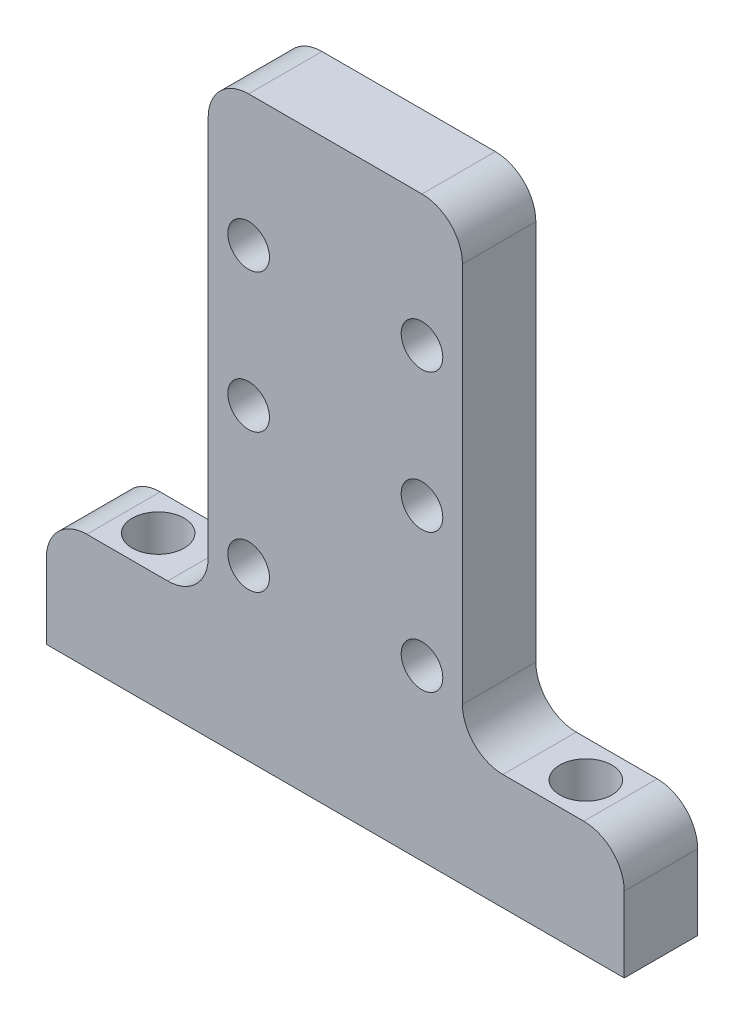
ISO-10303-21;
HEADER;
FILE_DESCRIPTION(('STEP AP214'),'2;1');
FILE_NAME('part.step','',(''),(''),'','','');
FILE_SCHEMA(('AUTOMOTIVE_DESIGN { 1 0 10303 214 1 1 1 1 }'));
ENDSEC;
DATA;
#1=APPLICATION_CONTEXT('core data for automotive mechanical design processes');
#2=APPLICATION_PROTOCOL_DEFINITION('international standard','automotive_design',2000,#1);
#3=PRODUCT_CONTEXT('',#1,'mechanical');
#4=PRODUCT('Part','Part','',(#3));
#5=PRODUCT_RELATED_PRODUCT_CATEGORY('part','',(#4));
#6=PRODUCT_DEFINITION_FORMATION('','',#4);
#7=PRODUCT_DEFINITION_CONTEXT('part definition',#1,'design');
#8=PRODUCT_DEFINITION('design','',#6,#7);
#9=PRODUCT_DEFINITION_SHAPE('','',#8);
#10=(LENGTH_UNIT() NAMED_UNIT(*) SI_UNIT(.MILLI.,.METRE.));
#11=(NAMED_UNIT(*) PLANE_ANGLE_UNIT() SI_UNIT($,.RADIAN.));
#12=(NAMED_UNIT(*) SI_UNIT($,.STERADIAN.) SOLID_ANGLE_UNIT());
#13=UNCERTAINTY_MEASURE_WITH_UNIT(LENGTH_MEASURE(1.E-05),#10,'distance_accuracy_value','');
#14=(GEOMETRIC_REPRESENTATION_CONTEXT(3) GLOBAL_UNCERTAINTY_ASSIGNED_CONTEXT((#13)) GLOBAL_UNIT_ASSIGNED_CONTEXT((#10,
#11,#12)) REPRESENTATION_CONTEXT('',''));
#15=CARTESIAN_POINT('',(0.,0.,0.));
#16=DIRECTION('',(0.,0.,1.));
#17=DIRECTION('',(1.,0.,0.));
#18=AXIS2_PLACEMENT_3D('',#15,#16,#17);
#19=CARTESIAN_POINT('',(25.,0.,6.35));
#20=DIRECTION('',(-1.,0.,0.));
#21=DIRECTION('',(0.,0.,1.));
#22=AXIS2_PLACEMENT_3D('',#19,#20,#21);
#23=PLANE('',#22);
#24=DIRECTION('',(0.,1.,0.));
#25=VECTOR('',#24,1.);
#26=CARTESIAN_POINT('',(25.,0.,0.));
#27=LINE('',#26,#25);
#28=CARTESIAN_POINT('',(25.,0.,0.));
#29=VERTEX_POINT('',#28);
#30=CARTESIAN_POINT('',(25.,6.5,0.));
#31=VERTEX_POINT('',#30);
#32=EDGE_CURVE('E168',#29,#31,#27,.T.);
#33=ORIENTED_EDGE('',*,*,#32,.T.);
#34=DIRECTION('',(0.,0.,-1.));
#35=VECTOR('',#34,1.);
#36=CARTESIAN_POINT('',(25.,6.5,6.35));
#37=LINE('',#36,#35);
#38=CARTESIAN_POINT('',(25.,6.5,6.35));
#39=VERTEX_POINT('',#38);
#40=EDGE_CURVE('E230',#31,#39,#37,.F.);
#41=ORIENTED_EDGE('',*,*,#40,.T.);
#42=DIRECTION('',(0.,1.,0.));
#43=VECTOR('',#42,1.);
#44=CARTESIAN_POINT('',(25.,0.,6.35));
#45=LINE('',#44,#43);
#46=CARTESIAN_POINT('',(25.,0.,6.35));
#47=VERTEX_POINT('',#46);
#48=EDGE_CURVE('E186',#47,#39,#45,.T.);
#49=ORIENTED_EDGE('',*,*,#48,.F.);
#50=DIRECTION('',(0.,0.,-1.));
#51=VECTOR('',#50,1.);
#52=CARTESIAN_POINT('',(25.,0.,6.35));
#53=LINE('',#52,#51);
#54=EDGE_CURVE('E159',#47,#29,#53,.T.);
#55=ORIENTED_EDGE('',*,*,#54,.T.);
#56=EDGE_LOOP('',(#33,#41,#49,#55));
#57=FACE_BOUND('',#56,.T.);
#58=ADVANCED_FACE('F35',(#57),#23,.F.);
#59=CARTESIAN_POINT('',(25.,10.,6.35));
#60=DIRECTION('',(0.,-1.,0.));
#61=DIRECTION('',(1.,0.,0.));
#62=AXIS2_PLACEMENT_3D('',#59,#60,#61);
#63=PLANE('',#62);
#64=CARTESIAN_POINT('',(18.5,10.,3.175));
#65=DIRECTION('',(0.,1.,0.));
#66=DIRECTION('',(0.,0.,1.));
#67=AXIS2_PLACEMENT_3D('',#64,#65,#66);
#68=CIRCLE('',#67,2.25);
#69=CARTESIAN_POINT('',(18.5,10.,5.42499999999999));
#70=VERTEX_POINT('',#69);
#71=EDGE_CURVE('E270',#70,#70,#68,.T.);
#72=ORIENTED_EDGE('',*,*,#71,.F.);
#73=EDGE_LOOP('',(#72));
#74=FACE_BOUND('',#73,.T.);
#75=DIRECTION('',(-1.,0.,0.));
#76=VECTOR('',#75,1.);
#77=CARTESIAN_POINT('',(25.,10.,6.35));
#78=LINE('',#77,#76);
#79=CARTESIAN_POINT('',(21.5,10.,6.35));
#80=VERTEX_POINT('',#79);
#81=CARTESIAN_POINT('',(14.5,10.,6.35));
#82=VERTEX_POINT('',#81);
#83=EDGE_CURVE('E247',#80,#82,#78,.T.);
#84=ORIENTED_EDGE('',*,*,#83,.F.);
#85=DIRECTION('',(0.,0.,-1.));
#86=VECTOR('',#85,1.);
#87=CARTESIAN_POINT('',(21.5,10.,6.35));
#88=LINE('',#87,#86);
#89=CARTESIAN_POINT('',(21.5,10.,0.));
#90=VERTEX_POINT('',#89);
#91=EDGE_CURVE('E227',#80,#90,#88,.T.);
#92=ORIENTED_EDGE('',*,*,#91,.T.);
#93=DIRECTION('',(-1.,0.,0.));
#94=VECTOR('',#93,1.);
#95=CARTESIAN_POINT('',(25.,10.,0.));
#96=LINE('',#95,#94);
#97=CARTESIAN_POINT('',(14.5,10.,0.));
#98=VERTEX_POINT('',#97);
#99=EDGE_CURVE('E171',#90,#98,#96,.T.);
#100=ORIENTED_EDGE('',*,*,#99,.T.);
#101=DIRECTION('',(0.,0.,-1.));
#102=VECTOR('',#101,1.);
#103=CARTESIAN_POINT('',(14.5,10.,6.35));
#104=LINE('',#103,#102);
#105=EDGE_CURVE('E190',#98,#82,#104,.F.);
#106=ORIENTED_EDGE('',*,*,#105,.T.);
#107=EDGE_LOOP('',(#84,#92,#100,#106));
#108=FACE_BOUND('',#107,.T.);
#109=ADVANCED_FACE('F349',(#74,#108),#63,.F.);
#110=CARTESIAN_POINT('',(11.,10.,6.35));
#111=DIRECTION('',(-1.,0.,0.));
#112=DIRECTION('',(0.,-1.,0.));
#113=AXIS2_PLACEMENT_3D('',#110,#111,#112);
#114=PLANE('',#113);
#115=DIRECTION('',(0.,1.,0.));
#116=VECTOR('',#115,1.);
#117=CARTESIAN_POINT('',(11.,10.,0.));
#118=LINE('',#117,#116);
#119=CARTESIAN_POINT('',(11.,13.5,0.));
#120=VERTEX_POINT('',#119);
#121=CARTESIAN_POINT('',(11.,46.5,0.));
#122=VERTEX_POINT('',#121);
#123=EDGE_CURVE('E174',#120,#122,#118,.T.);
#124=ORIENTED_EDGE('',*,*,#123,.T.);
#125=DIRECTION('',(0.,0.,-1.));
#126=VECTOR('',#125,1.);
#127=CARTESIAN_POINT('',(11.,46.5,6.35));
#128=LINE('',#127,#126);
#129=CARTESIAN_POINT('',(11.,46.5,6.35));
#130=VERTEX_POINT('',#129);
#131=EDGE_CURVE('E43',#122,#130,#128,.F.);
#132=ORIENTED_EDGE('',*,*,#131,.T.);
#133=DIRECTION('',(0.,1.,0.));
#134=VECTOR('',#133,1.);
#135=CARTESIAN_POINT('',(11.,10.,6.35));
#136=LINE('',#135,#134);
#137=CARTESIAN_POINT('',(11.,13.5,6.35));
#138=VERTEX_POINT('',#137);
#139=EDGE_CURVE('E240',#138,#130,#136,.T.);
#140=ORIENTED_EDGE('',*,*,#139,.F.);
#141=DIRECTION('',(0.,0.,-1.));
#142=VECTOR('',#141,1.);
#143=CARTESIAN_POINT('',(11.,13.5,0.));
#144=LINE('',#143,#142);
#145=EDGE_CURVE('E158',#138,#120,#144,.T.);
#146=ORIENTED_EDGE('',*,*,#145,.T.);
#147=EDGE_LOOP('',(#124,#132,#140,#146));
#148=FACE_BOUND('',#147,.T.);
#149=ADVANCED_FACE('F239',(#148),#114,.F.);
#150=CARTESIAN_POINT('',(11.,50.,6.35));
#151=DIRECTION('',(0.,-1.,0.));
#152=DIRECTION('',(0.,0.,-1.));
#153=AXIS2_PLACEMENT_3D('',#150,#151,#152);
#154=PLANE('',#153);
#155=DIRECTION('',(-1.,0.,0.));
#156=VECTOR('',#155,1.);
#157=CARTESIAN_POINT('',(11.,50.,6.35));
#158=LINE('',#157,#156);
#159=CARTESIAN_POINT('',(7.5,50.,6.35));
#160=VERTEX_POINT('',#159);
#161=CARTESIAN_POINT('',(-7.5,50.,6.35));
#162=VERTEX_POINT('',#161);
#163=EDGE_CURVE('E246',#160,#162,#158,.T.);
#164=ORIENTED_EDGE('',*,*,#163,.F.);
#165=DIRECTION('',(0.,0.,-1.));
#166=VECTOR('',#165,1.);
#167=CARTESIAN_POINT('',(7.5,50.,6.35));
#168=LINE('',#167,#166);
#169=CARTESIAN_POINT('',(7.5,50.,0.));
#170=VERTEX_POINT('',#169);
#171=EDGE_CURVE('E233',#160,#170,#168,.T.);
#172=ORIENTED_EDGE('',*,*,#171,.T.);
#173=DIRECTION('',(-1.,0.,0.));
#174=VECTOR('',#173,1.);
#175=CARTESIAN_POINT('',(11.,50.,0.));
#176=LINE('',#175,#174);
#177=CARTESIAN_POINT('',(-7.5,50.,0.));
#178=VERTEX_POINT('',#177);
#179=EDGE_CURVE('E177',#170,#178,#176,.T.);
#180=ORIENTED_EDGE('',*,*,#179,.T.);
#181=DIRECTION('',(0.,0.,-1.));
#182=VECTOR('',#181,1.);
#183=CARTESIAN_POINT('',(-7.5,50.,6.35));
#184=LINE('',#183,#182);
#185=EDGE_CURVE('E58',#178,#162,#184,.F.);
#186=ORIENTED_EDGE('',*,*,#185,.T.);
#187=EDGE_LOOP('',(#164,#172,#180,#186));
#188=FACE_BOUND('',#187,.T.);
#189=ADVANCED_FACE('F252',(#188),#154,.F.);
#190=CARTESIAN_POINT('',(-11.,9.99999999999999,6.35));
#191=DIRECTION('',(1.,0.,0.));
#192=DIRECTION('',(0.,1.,0.));
#193=AXIS2_PLACEMENT_3D('',#190,#191,#192);
#194=PLANE('',#193);
#195=DIRECTION('',(0.,-1.,0.));
#196=VECTOR('',#195,1.);
#197=CARTESIAN_POINT('',(-11.,9.99999999999999,6.35));
#198=LINE('',#197,#196);
#199=CARTESIAN_POINT('',(-11.,46.5,6.35));
#200=VERTEX_POINT('',#199);
#201=CARTESIAN_POINT('',(-11.,13.5,6.35));
#202=VERTEX_POINT('',#201);
#203=EDGE_CURVE('E260',#200,#202,#198,.T.);
#204=ORIENTED_EDGE('',*,*,#203,.F.);
#205=DIRECTION('',(0.,0.,-1.));
#206=VECTOR('',#205,1.);
#207=CARTESIAN_POINT('',(-11.,46.5,6.35));
#208=LINE('',#207,#206);
#209=CARTESIAN_POINT('',(-11.,46.5,0.));
#210=VERTEX_POINT('',#209);
#211=EDGE_CURVE('E11',#200,#210,#208,.T.);
#212=ORIENTED_EDGE('',*,*,#211,.T.);
#213=DIRECTION('',(0.,-1.,0.));
#214=VECTOR('',#213,1.);
#215=CARTESIAN_POINT('',(-11.,9.99999999999999,0.));
#216=LINE('',#215,#214);
#217=CARTESIAN_POINT('',(-11.,13.5,0.));
#218=VERTEX_POINT('',#217);
#219=EDGE_CURVE('E179',#210,#218,#216,.T.);
#220=ORIENTED_EDGE('',*,*,#219,.T.);
#221=DIRECTION('',(0.,0.,-1.));
#222=VECTOR('',#221,1.);
#223=CARTESIAN_POINT('',(-11.,13.5,6.35));
#224=LINE('',#223,#222);
#225=EDGE_CURVE('E196',#218,#202,#224,.F.);
#226=ORIENTED_EDGE('',*,*,#225,.T.);
#227=EDGE_LOOP('',(#204,#212,#220,#226));
#228=FACE_BOUND('',#227,.T.);
#229=ADVANCED_FACE('F259',(#228),#194,.F.);
#230=CARTESIAN_POINT('',(-25.,9.99999999999999,6.35));
#231=DIRECTION('',(0.,-1.,0.));
#232=DIRECTION('',(1.,0.,0.));
#233=AXIS2_PLACEMENT_3D('',#230,#231,#232);
#234=PLANE('',#233);
#235=CARTESIAN_POINT('',(-18.5,9.99999999999999,3.175));
#236=DIRECTION('',(0.,1.,0.));
#237=DIRECTION('',(0.,0.,1.));
#238=AXIS2_PLACEMENT_3D('',#235,#236,#237);
#239=CIRCLE('',#238,2.25);
#240=CARTESIAN_POINT('',(-18.5,9.99999999999999,5.425));
#241=VERTEX_POINT('',#240);
#242=EDGE_CURVE('E276',#241,#241,#239,.T.);
#243=ORIENTED_EDGE('',*,*,#242,.F.);
#244=EDGE_LOOP('',(#243));
#245=FACE_BOUND('',#244,.T.);
#246=DIRECTION('',(-1.,0.,0.));
#247=VECTOR('',#246,1.);
#248=CARTESIAN_POINT('',(-25.,9.99999999999999,0.));
#249=LINE('',#248,#247);
#250=CARTESIAN_POINT('',(-14.5,9.99999999999999,0.));
#251=VERTEX_POINT('',#250);
#252=CARTESIAN_POINT('',(-21.5,9.99999999999999,0.));
#253=VERTEX_POINT('',#252);
#254=EDGE_CURVE('E181',#251,#253,#249,.T.);
#255=ORIENTED_EDGE('',*,*,#254,.T.);
#256=DIRECTION('',(0.,0.,-1.));
#257=VECTOR('',#256,1.);
#258=CARTESIAN_POINT('',(-21.5,9.99999999999999,6.35));
#259=LINE('',#258,#257);
#260=CARTESIAN_POINT('',(-21.5,9.99999999999999,6.35));
#261=VERTEX_POINT('',#260);
#262=EDGE_CURVE('E219',#253,#261,#259,.F.);
#263=ORIENTED_EDGE('',*,*,#262,.T.);
#264=DIRECTION('',(-1.,0.,0.));
#265=VECTOR('',#264,1.);
#266=CARTESIAN_POINT('',(-25.,9.99999999999999,6.35));
#267=LINE('',#266,#265);
#268=CARTESIAN_POINT('',(-14.5,9.99999999999999,6.35));
#269=VERTEX_POINT('',#268);
#270=EDGE_CURVE('E149',#269,#261,#267,.T.);
#271=ORIENTED_EDGE('',*,*,#270,.F.);
#272=DIRECTION('',(0.,0.,-1.));
#273=VECTOR('',#272,1.);
#274=CARTESIAN_POINT('',(-14.5,9.99999999999999,0.));
#275=LINE('',#274,#273);
#276=EDGE_CURVE('E193',#269,#251,#275,.T.);
#277=ORIENTED_EDGE('',*,*,#276,.T.);
#278=EDGE_LOOP('',(#255,#263,#271,#277));
#279=FACE_BOUND('',#278,.T.);
#280=ADVANCED_FACE('F425',(#245,#279),#234,.F.);
#281=CARTESIAN_POINT('',(-25.,0.,6.35));
#282=DIRECTION('',(1.,0.,0.));
#283=DIRECTION('',(0.,1.,0.));
#284=AXIS2_PLACEMENT_3D('',#281,#282,#283);
#285=PLANE('',#284);
#286=DIRECTION('',(0.,-1.,0.));
#287=VECTOR('',#286,1.);
#288=CARTESIAN_POINT('',(-25.,0.,6.35));
#289=LINE('',#288,#287);
#290=CARTESIAN_POINT('',(-25.,6.49999999999999,6.35));
#291=VERTEX_POINT('',#290);
#292=CARTESIAN_POINT('',(-25.,0.,6.35));
#293=VERTEX_POINT('',#292);
#294=EDGE_CURVE('E136',#291,#293,#289,.T.);
#295=ORIENTED_EDGE('',*,*,#294,.F.);
#296=DIRECTION('',(0.,0.,-1.));
#297=VECTOR('',#296,1.);
#298=CARTESIAN_POINT('',(-25.,6.49999999999999,6.35));
#299=LINE('',#298,#297);
#300=CARTESIAN_POINT('',(-25.,6.49999999999999,0.));
#301=VERTEX_POINT('',#300);
#302=EDGE_CURVE('E209',#291,#301,#299,.T.);
#303=ORIENTED_EDGE('',*,*,#302,.T.);
#304=DIRECTION('',(0.,-1.,0.));
#305=VECTOR('',#304,1.);
#306=CARTESIAN_POINT('',(-25.,0.,0.));
#307=LINE('',#306,#305);
#308=CARTESIAN_POINT('',(-25.,0.,0.));
#309=VERTEX_POINT('',#308);
#310=EDGE_CURVE('E155',#301,#309,#307,.T.);
#311=ORIENTED_EDGE('',*,*,#310,.T.);
#312=DIRECTION('',(0.,0.,-1.));
#313=VECTOR('',#312,1.);
#314=CARTESIAN_POINT('',(-25.,0.,6.35));
#315=LINE('',#314,#313);
#316=EDGE_CURVE('E152',#293,#309,#315,.T.);
#317=ORIENTED_EDGE('',*,*,#316,.F.);
#318=EDGE_LOOP('',(#295,#303,#311,#317));
#319=FACE_BOUND('',#318,.T.);
#320=ADVANCED_FACE('F153',(#319),#285,.F.);
#321=CARTESIAN_POINT('',(-25.,0.,6.35));
#322=DIRECTION('',(0.,1.,0.));
#323=DIRECTION('',(-1.,0.,0.));
#324=AXIS2_PLACEMENT_3D('',#321,#322,#323);
#325=PLANE('',#324);
#326=CARTESIAN_POINT('',(-18.5,0.,3.175));
#327=DIRECTION('',(0.,1.,0.));
#328=DIRECTION('',(0.,0.,1.));
#329=AXIS2_PLACEMENT_3D('',#326,#327,#328);
#330=CIRCLE('',#329,2.25);
#331=CARTESIAN_POINT('',(-18.5,0.,5.425));
#332=VERTEX_POINT('',#331);
#333=EDGE_CURVE('E273',#332,#332,#330,.T.);
#334=ORIENTED_EDGE('',*,*,#333,.T.);
#335=EDGE_LOOP('',(#334));
#336=FACE_BOUND('',#335,.T.);
#337=CARTESIAN_POINT('',(18.5,0.,3.175));
#338=DIRECTION('',(0.,1.,0.));
#339=DIRECTION('',(0.,0.,1.));
#340=AXIS2_PLACEMENT_3D('',#337,#338,#339);
#341=CIRCLE('',#340,2.25);
#342=CARTESIAN_POINT('',(18.5,0.,5.42499999999999));
#343=VERTEX_POINT('',#342);
#344=EDGE_CURVE('E172',#343,#343,#341,.T.);
#345=ORIENTED_EDGE('',*,*,#344,.T.);
#346=EDGE_LOOP('',(#345));
#347=FACE_BOUND('',#346,.T.);
#348=DIRECTION('',(1.,0.,0.));
#349=VECTOR('',#348,1.);
#350=CARTESIAN_POINT('',(-25.,0.,0.));
#351=LINE('',#350,#349);
#352=EDGE_CURVE('E185',#309,#29,#351,.T.);
#353=ORIENTED_EDGE('',*,*,#352,.T.);
#354=ORIENTED_EDGE('',*,*,#54,.F.);
#355=DIRECTION('',(1.,0.,0.));
#356=VECTOR('',#355,1.);
#357=CARTESIAN_POINT('',(-25.,0.,6.35));
#358=LINE('',#357,#356);
#359=EDGE_CURVE('E142',#293,#47,#358,.T.);
#360=ORIENTED_EDGE('',*,*,#359,.F.);
#361=ORIENTED_EDGE('',*,*,#316,.T.);
#362=EDGE_LOOP('',(#353,#354,#360,#361));
#363=FACE_BOUND('',#362,.T.);
#364=ADVANCED_FACE('F161',(#336,#347,#363),#325,.F.);
#365=CARTESIAN_POINT('',(0.,0.,6.35));
#366=DIRECTION('',(0.,0.,1.));
#367=DIRECTION('',(1.,0.,0.));
#368=AXIS2_PLACEMENT_3D('',#365,#366,#367);
#369=PLANE('',#368);
#370=CARTESIAN_POINT('',(-7.5,26.65,6.35));
#371=DIRECTION('',(0.,0.,1.));
#372=DIRECTION('',(1.,0.,0.));
#373=AXIS2_PLACEMENT_3D('',#370,#371,#372);
#374=CIRCLE('',#373,1.79999999999999);
#375=CARTESIAN_POINT('',(-5.70000000000001,26.65,6.35));
#376=VERTEX_POINT('',#375);
#377=EDGE_CURVE('E312',#376,#376,#374,.T.);
#378=ORIENTED_EDGE('',*,*,#377,.F.);
#379=EDGE_LOOP('',(#378));
#380=FACE_BOUND('',#379,.T.);
#381=CARTESIAN_POINT('',(7.5,38.65,6.35));
#382=DIRECTION('',(0.,0.,1.));
#383=DIRECTION('',(1.,0.,0.));
#384=AXIS2_PLACEMENT_3D('',#381,#382,#383);
#385=CIRCLE('',#384,1.79999999999999);
#386=CARTESIAN_POINT('',(9.29999999999999,38.65,6.35));
#387=VERTEX_POINT('',#386);
#388=EDGE_CURVE('E306',#387,#387,#385,.T.);
#389=ORIENTED_EDGE('',*,*,#388,.F.);
#390=EDGE_LOOP('',(#389));
#391=FACE_BOUND('',#390,.T.);
#392=CARTESIAN_POINT('',(-7.5,14.65,6.35));
#393=DIRECTION('',(0.,0.,1.));
#394=DIRECTION('',(1.,0.,0.));
#395=AXIS2_PLACEMENT_3D('',#392,#393,#394);
#396=CIRCLE('',#395,1.79999999999999);
#397=CARTESIAN_POINT('',(-5.70000000000001,14.65,6.35));
#398=VERTEX_POINT('',#397);
#399=EDGE_CURVE('E300',#398,#398,#396,.T.);
#400=ORIENTED_EDGE('',*,*,#399,.F.);
#401=EDGE_LOOP('',(#400));
#402=FACE_BOUND('',#401,.T.);
#403=CARTESIAN_POINT('',(7.5,26.65,6.35));
#404=DIRECTION('',(0.,0.,1.));
#405=DIRECTION('',(1.,0.,0.));
#406=AXIS2_PLACEMENT_3D('',#403,#404,#405);
#407=CIRCLE('',#406,1.79999999999999);
#408=CARTESIAN_POINT('',(9.29999999999999,26.65,6.35));
#409=VERTEX_POINT('',#408);
#410=EDGE_CURVE('E294',#409,#409,#407,.T.);
#411=ORIENTED_EDGE('',*,*,#410,.F.);
#412=EDGE_LOOP('',(#411));
#413=FACE_BOUND('',#412,.T.);
#414=CARTESIAN_POINT('',(-7.5,38.65,6.35));
#415=DIRECTION('',(0.,0.,1.));
#416=DIRECTION('',(1.,0.,0.));
#417=AXIS2_PLACEMENT_3D('',#414,#415,#416);
#418=CIRCLE('',#417,1.79999999999999);
#419=CARTESIAN_POINT('',(-5.70000000000001,38.65,6.35));
#420=VERTEX_POINT('',#419);
#421=EDGE_CURVE('E288',#420,#420,#418,.T.);
#422=ORIENTED_EDGE('',*,*,#421,.F.);
#423=EDGE_LOOP('',(#422));
#424=FACE_BOUND('',#423,.T.);
#425=CARTESIAN_POINT('',(7.50000000000001,14.65,6.35));
#426=DIRECTION('',(0.,0.,1.));
#427=DIRECTION('',(1.,0.,0.));
#428=AXIS2_PLACEMENT_3D('',#425,#426,#427);
#429=CIRCLE('',#428,1.79999999999999);
#430=CARTESIAN_POINT('',(9.29999999999999,14.65,6.35));
#431=VERTEX_POINT('',#430);
#432=EDGE_CURVE('E282',#431,#431,#429,.T.);
#433=ORIENTED_EDGE('',*,*,#432,.F.);
#434=EDGE_LOOP('',(#433));
#435=FACE_BOUND('',#434,.T.);
#436=ORIENTED_EDGE('',*,*,#270,.T.);
#437=CARTESIAN_POINT('',(-21.5,6.49999999999999,6.35));
#438=DIRECTION('',(0.,0.,1.));
#439=DIRECTION('',(1.,0.,0.));
#440=AXIS2_PLACEMENT_3D('',#437,#438,#439);
#441=CIRCLE('',#440,3.5);
#442=EDGE_CURVE('E145',#261,#291,#441,.T.);
#443=ORIENTED_EDGE('',*,*,#442,.T.);
#444=ORIENTED_EDGE('',*,*,#294,.T.);
#445=ORIENTED_EDGE('',*,*,#359,.T.);
#446=ORIENTED_EDGE('',*,*,#48,.T.);
#447=CARTESIAN_POINT('',(21.5,6.5,6.35));
#448=DIRECTION('',(0.,0.,1.));
#449=DIRECTION('',(1.,0.,0.));
#450=AXIS2_PLACEMENT_3D('',#447,#448,#449);
#451=CIRCLE('',#450,3.5);
#452=EDGE_CURVE('E224',#39,#80,#451,.T.);
#453=ORIENTED_EDGE('',*,*,#452,.T.);
#454=ORIENTED_EDGE('',*,*,#83,.T.);
#455=CARTESIAN_POINT('',(14.5,13.5,6.35));
#456=DIRECTION('',(0.,0.,1.));
#457=DIRECTION('',(1.,0.,0.));
#458=AXIS2_PLACEMENT_3D('',#455,#456,#457);
#459=CIRCLE('',#458,3.5);
#460=EDGE_CURVE('E202',#82,#138,#459,.F.);
#461=ORIENTED_EDGE('',*,*,#460,.T.);
#462=ORIENTED_EDGE('',*,*,#139,.T.);
#463=CARTESIAN_POINT('',(7.5,46.5,6.35));
#464=DIRECTION('',(0.,0.,1.));
#465=DIRECTION('',(1.,0.,0.));
#466=AXIS2_PLACEMENT_3D('',#463,#464,#465);
#467=CIRCLE('',#466,3.5);
#468=EDGE_CURVE('E222',#130,#160,#467,.T.);
#469=ORIENTED_EDGE('',*,*,#468,.T.);
#470=ORIENTED_EDGE('',*,*,#163,.T.);
#471=CARTESIAN_POINT('',(-7.5,46.5,6.35));
#472=DIRECTION('',(0.,0.,1.));
#473=DIRECTION('',(1.,0.,0.));
#474=AXIS2_PLACEMENT_3D('',#471,#472,#473);
#475=CIRCLE('',#474,3.5);
#476=EDGE_CURVE('E50',#162,#200,#475,.T.);
#477=ORIENTED_EDGE('',*,*,#476,.T.);
#478=ORIENTED_EDGE('',*,*,#203,.T.);
#479=CARTESIAN_POINT('',(-14.5,13.5,6.35));
#480=DIRECTION('',(0.,0.,1.));
#481=DIRECTION('',(1.,0.,0.));
#482=AXIS2_PLACEMENT_3D('',#479,#480,#481);
#483=CIRCLE('',#482,3.5);
#484=EDGE_CURVE('E207',#202,#269,#483,.F.);
#485=ORIENTED_EDGE('',*,*,#484,.T.);
#486=EDGE_LOOP('',(#436,#443,#444,#445,#446,#453,#454,#461,#462,#469,#470,#477,#478,#485));
#487=FACE_BOUND('',#486,.T.);
#488=ADVANCED_FACE('F139',(#380,#391,#402,#413,#424,#435,#487),#369,.T.);
#489=CARTESIAN_POINT('',(0.,0.,0.));
#490=DIRECTION('',(0.,0.,1.));
#491=DIRECTION('',(1.,0.,0.));
#492=AXIS2_PLACEMENT_3D('',#489,#490,#491);
#493=PLANE('',#492);
#494=CARTESIAN_POINT('',(-7.5,26.65,0.));
#495=DIRECTION('',(0.,0.,1.));
#496=DIRECTION('',(1.,0.,0.));
#497=AXIS2_PLACEMENT_3D('',#494,#495,#496);
#498=CIRCLE('',#497,1.8);
#499=CARTESIAN_POINT('',(-5.7,26.65,0.));
#500=VERTEX_POINT('',#499);
#501=EDGE_CURVE('E309',#500,#500,#498,.T.);
#502=ORIENTED_EDGE('',*,*,#501,.T.);
#503=EDGE_LOOP('',(#502));
#504=FACE_BOUND('',#503,.T.);
#505=CARTESIAN_POINT('',(7.5,38.65,0.));
#506=DIRECTION('',(0.,0.,1.));
#507=DIRECTION('',(1.,0.,0.));
#508=AXIS2_PLACEMENT_3D('',#505,#506,#507);
#509=CIRCLE('',#508,1.8);
#510=CARTESIAN_POINT('',(9.3,38.65,0.));
#511=VERTEX_POINT('',#510);
#512=EDGE_CURVE('E303',#511,#511,#509,.T.);
#513=ORIENTED_EDGE('',*,*,#512,.T.);
#514=EDGE_LOOP('',(#513));
#515=FACE_BOUND('',#514,.T.);
#516=CARTESIAN_POINT('',(-7.5,14.65,0.));
#517=DIRECTION('',(0.,0.,1.));
#518=DIRECTION('',(1.,0.,0.));
#519=AXIS2_PLACEMENT_3D('',#516,#517,#518);
#520=CIRCLE('',#519,1.8);
#521=CARTESIAN_POINT('',(-5.7,14.65,0.));
#522=VERTEX_POINT('',#521);
#523=EDGE_CURVE('E297',#522,#522,#520,.T.);
#524=ORIENTED_EDGE('',*,*,#523,.T.);
#525=EDGE_LOOP('',(#524));
#526=FACE_BOUND('',#525,.T.);
#527=CARTESIAN_POINT('',(7.5,26.65,0.));
#528=DIRECTION('',(0.,0.,1.));
#529=DIRECTION('',(1.,0.,0.));
#530=AXIS2_PLACEMENT_3D('',#527,#528,#529);
#531=CIRCLE('',#530,1.8);
#532=CARTESIAN_POINT('',(9.3,26.65,0.));
#533=VERTEX_POINT('',#532);
#534=EDGE_CURVE('E291',#533,#533,#531,.T.);
#535=ORIENTED_EDGE('',*,*,#534,.T.);
#536=EDGE_LOOP('',(#535));
#537=FACE_BOUND('',#536,.T.);
#538=CARTESIAN_POINT('',(-7.5,38.65,0.));
#539=DIRECTION('',(0.,0.,1.));
#540=DIRECTION('',(1.,0.,0.));
#541=AXIS2_PLACEMENT_3D('',#538,#539,#540);
#542=CIRCLE('',#541,1.8);
#543=CARTESIAN_POINT('',(-5.7,38.65,0.));
#544=VERTEX_POINT('',#543);
#545=EDGE_CURVE('E285',#544,#544,#542,.T.);
#546=ORIENTED_EDGE('',*,*,#545,.T.);
#547=EDGE_LOOP('',(#546));
#548=FACE_BOUND('',#547,.T.);
#549=CARTESIAN_POINT('',(7.50000000000001,14.65,0.));
#550=DIRECTION('',(0.,0.,1.));
#551=DIRECTION('',(1.,0.,0.));
#552=AXIS2_PLACEMENT_3D('',#549,#550,#551);
#553=CIRCLE('',#552,1.8);
#554=CARTESIAN_POINT('',(9.3,14.65,0.));
#555=VERTEX_POINT('',#554);
#556=EDGE_CURVE('E279',#555,#555,#553,.T.);
#557=ORIENTED_EDGE('',*,*,#556,.T.);
#558=EDGE_LOOP('',(#557));
#559=FACE_BOUND('',#558,.T.);
#560=ORIENTED_EDGE('',*,*,#310,.F.);
#561=CARTESIAN_POINT('',(-21.5,6.49999999999999,0.));
#562=DIRECTION('',(0.,0.,1.));
#563=DIRECTION('',(1.,0.,0.));
#564=AXIS2_PLACEMENT_3D('',#561,#562,#563);
#565=CIRCLE('',#564,3.5);
#566=EDGE_CURVE('E217',#301,#253,#565,.F.);
#567=ORIENTED_EDGE('',*,*,#566,.T.);
#568=ORIENTED_EDGE('',*,*,#254,.F.);
#569=CARTESIAN_POINT('',(-14.5,13.5,0.));
#570=DIRECTION('',(0.,0.,1.));
#571=DIRECTION('',(1.,0.,0.));
#572=AXIS2_PLACEMENT_3D('',#569,#570,#571);
#573=CIRCLE('',#572,3.5);
#574=EDGE_CURVE('E204',#251,#218,#573,.T.);
#575=ORIENTED_EDGE('',*,*,#574,.T.);
#576=ORIENTED_EDGE('',*,*,#219,.F.);
#577=CARTESIAN_POINT('',(-7.5,46.5,0.));
#578=DIRECTION('',(0.,0.,1.));
#579=DIRECTION('',(1.,0.,0.));
#580=AXIS2_PLACEMENT_3D('',#577,#578,#579);
#581=CIRCLE('',#580,3.5);
#582=EDGE_CURVE('E211',#210,#178,#581,.F.);
#583=ORIENTED_EDGE('',*,*,#582,.T.);
#584=ORIENTED_EDGE('',*,*,#179,.F.);
#585=CARTESIAN_POINT('',(7.5,46.5,0.));
#586=DIRECTION('',(0.,0.,1.));
#587=DIRECTION('',(1.,0.,0.));
#588=AXIS2_PLACEMENT_3D('',#585,#586,#587);
#589=CIRCLE('',#588,3.5);
#590=EDGE_CURVE('E213',#170,#122,#589,.F.);
#591=ORIENTED_EDGE('',*,*,#590,.T.);
#592=ORIENTED_EDGE('',*,*,#123,.F.);
#593=CARTESIAN_POINT('',(14.5,13.5,0.));
#594=DIRECTION('',(0.,0.,1.));
#595=DIRECTION('',(1.,0.,0.));
#596=AXIS2_PLACEMENT_3D('',#593,#594,#595);
#597=CIRCLE('',#596,3.5);
#598=EDGE_CURVE('E199',#120,#98,#597,.T.);
#599=ORIENTED_EDGE('',*,*,#598,.T.);
#600=ORIENTED_EDGE('',*,*,#99,.F.);
#601=CARTESIAN_POINT('',(21.5,6.5,0.));
#602=DIRECTION('',(0.,0.,1.));
#603=DIRECTION('',(1.,0.,0.));
#604=AXIS2_PLACEMENT_3D('',#601,#602,#603);
#605=CIRCLE('',#604,3.5);
#606=EDGE_CURVE('E215',#90,#31,#605,.F.);
#607=ORIENTED_EDGE('',*,*,#606,.T.);
#608=ORIENTED_EDGE('',*,*,#32,.F.);
#609=ORIENTED_EDGE('',*,*,#352,.F.);
#610=EDGE_LOOP('',(#560,#567,#568,#575,#576,#583,#584,#591,#592,#599,#600,#607,#608,#609));
#611=FACE_BOUND('',#610,.T.);
#612=ADVANCED_FACE('F254',(#504,#515,#526,#537,#548,#559,#611),#493,.F.);
#613=CARTESIAN_POINT('',(18.5,10.,3.175));
#614=DIRECTION('',(0.,1.,0.));
#615=DIRECTION('',(0.,0.,1.));
#616=AXIS2_PLACEMENT_3D('',#613,#614,#615);
#617=CYLINDRICAL_SURFACE('',#616,2.25);
#618=ORIENTED_EDGE('',*,*,#344,.F.);
#619=EDGE_LOOP('',(#618));
#620=FACE_BOUND('',#619,.T.);
#621=ORIENTED_EDGE('',*,*,#71,.T.);
#622=EDGE_LOOP('',(#621));
#623=FACE_BOUND('',#622,.T.);
#624=ADVANCED_FACE('F344',(#620,#623),#617,.F.);
#625=CARTESIAN_POINT('',(-18.5,9.99999999999999,3.175));
#626=DIRECTION('',(0.,1.,0.));
#627=DIRECTION('',(0.,0.,1.));
#628=AXIS2_PLACEMENT_3D('',#625,#626,#627);
#629=CYLINDRICAL_SURFACE('',#628,2.25);
#630=ORIENTED_EDGE('',*,*,#333,.F.);
#631=EDGE_LOOP('',(#630));
#632=FACE_BOUND('',#631,.T.);
#633=ORIENTED_EDGE('',*,*,#242,.T.);
#634=EDGE_LOOP('',(#633));
#635=FACE_BOUND('',#634,.T.);
#636=ADVANCED_FACE('F334',(#632,#635),#629,.F.);
#637=CARTESIAN_POINT('',(7.50000000000001,14.65,6.35));
#638=DIRECTION('',(0.,0.,1.));
#639=DIRECTION('',(1.,0.,0.));
#640=AXIS2_PLACEMENT_3D('',#637,#638,#639);
#641=CYLINDRICAL_SURFACE('',#640,1.79999999999999);
#642=ORIENTED_EDGE('',*,*,#556,.F.);
#643=EDGE_LOOP('',(#642));
#644=FACE_BOUND('',#643,.T.);
#645=ORIENTED_EDGE('',*,*,#432,.T.);
#646=EDGE_LOOP('',(#645));
#647=FACE_BOUND('',#646,.T.);
#648=ADVANCED_FACE('F331',(#644,#647),#641,.F.);
#649=CARTESIAN_POINT('',(-7.5,38.65,6.35));
#650=DIRECTION('',(0.,0.,1.));
#651=DIRECTION('',(1.,0.,0.));
#652=AXIS2_PLACEMENT_3D('',#649,#650,#651);
#653=CYLINDRICAL_SURFACE('',#652,1.79999999999999);
#654=ORIENTED_EDGE('',*,*,#545,.F.);
#655=EDGE_LOOP('',(#654));
#656=FACE_BOUND('',#655,.T.);
#657=ORIENTED_EDGE('',*,*,#421,.T.);
#658=EDGE_LOOP('',(#657));
#659=FACE_BOUND('',#658,.T.);
#660=ADVANCED_FACE('F333',(#656,#659),#653,.F.);
#661=CARTESIAN_POINT('',(7.5,26.65,6.35));
#662=DIRECTION('',(0.,0.,1.));
#663=DIRECTION('',(1.,0.,0.));
#664=AXIS2_PLACEMENT_3D('',#661,#662,#663);
#665=CYLINDRICAL_SURFACE('',#664,1.79999999999999);
#666=ORIENTED_EDGE('',*,*,#534,.F.);
#667=EDGE_LOOP('',(#666));
#668=FACE_BOUND('',#667,.T.);
#669=ORIENTED_EDGE('',*,*,#410,.T.);
#670=EDGE_LOOP('',(#669));
#671=FACE_BOUND('',#670,.T.);
#672=ADVANCED_FACE('F341',(#668,#671),#665,.F.);
#673=CARTESIAN_POINT('',(-7.5,14.65,6.35));
#674=DIRECTION('',(0.,0.,1.));
#675=DIRECTION('',(1.,0.,0.));
#676=AXIS2_PLACEMENT_3D('',#673,#674,#675);
#677=CYLINDRICAL_SURFACE('',#676,1.79999999999999);
#678=ORIENTED_EDGE('',*,*,#523,.F.);
#679=EDGE_LOOP('',(#678));
#680=FACE_BOUND('',#679,.T.);
#681=ORIENTED_EDGE('',*,*,#399,.T.);
#682=EDGE_LOOP('',(#681));
#683=FACE_BOUND('',#682,.T.);
#684=ADVANCED_FACE('F497',(#680,#683),#677,.F.);
#685=CARTESIAN_POINT('',(7.5,38.65,6.35));
#686=DIRECTION('',(0.,0.,1.));
#687=DIRECTION('',(1.,0.,0.));
#688=AXIS2_PLACEMENT_3D('',#685,#686,#687);
#689=CYLINDRICAL_SURFACE('',#688,1.79999999999999);
#690=ORIENTED_EDGE('',*,*,#512,.F.);
#691=EDGE_LOOP('',(#690));
#692=FACE_BOUND('',#691,.T.);
#693=ORIENTED_EDGE('',*,*,#388,.T.);
#694=EDGE_LOOP('',(#693));
#695=FACE_BOUND('',#694,.T.);
#696=ADVANCED_FACE('F487',(#692,#695),#689,.F.);
#697=CARTESIAN_POINT('',(-7.5,26.65,6.35));
#698=DIRECTION('',(0.,0.,1.));
#699=DIRECTION('',(1.,0.,0.));
#700=AXIS2_PLACEMENT_3D('',#697,#698,#699);
#701=CYLINDRICAL_SURFACE('',#700,1.79999999999999);
#702=ORIENTED_EDGE('',*,*,#501,.F.);
#703=EDGE_LOOP('',(#702));
#704=FACE_BOUND('',#703,.T.);
#705=ORIENTED_EDGE('',*,*,#377,.T.);
#706=EDGE_LOOP('',(#705));
#707=FACE_BOUND('',#706,.T.);
#708=ADVANCED_FACE('F316',(#704,#707),#701,.F.);
#709=CARTESIAN_POINT('',(14.5,13.5,6.35));
#710=DIRECTION('',(0.,0.,1.));
#711=DIRECTION('',(1.,0.,0.));
#712=AXIS2_PLACEMENT_3D('',#709,#710,#711);
#713=CYLINDRICAL_SURFACE('',#712,3.5);
#714=ORIENTED_EDGE('',*,*,#460,.F.);
#715=ORIENTED_EDGE('',*,*,#105,.F.);
#716=ORIENTED_EDGE('',*,*,#598,.F.);
#717=ORIENTED_EDGE('',*,*,#145,.F.);
#718=EDGE_LOOP('',(#714,#715,#716,#717));
#719=FACE_BOUND('',#718,.T.);
#720=ADVANCED_FACE('F359',(#719),#713,.F.);
#721=CARTESIAN_POINT('',(-14.5,13.5,6.35));
#722=DIRECTION('',(0.,0.,1.));
#723=DIRECTION('',(1.,0.,0.));
#724=AXIS2_PLACEMENT_3D('',#721,#722,#723);
#725=CYLINDRICAL_SURFACE('',#724,3.5);
#726=ORIENTED_EDGE('',*,*,#484,.F.);
#727=ORIENTED_EDGE('',*,*,#225,.F.);
#728=ORIENTED_EDGE('',*,*,#574,.F.);
#729=ORIENTED_EDGE('',*,*,#276,.F.);
#730=EDGE_LOOP('',(#726,#727,#728,#729));
#731=FACE_BOUND('',#730,.T.);
#732=ADVANCED_FACE('F362',(#731),#725,.F.);
#733=CARTESIAN_POINT('',(-21.5,6.49999999999999,6.35));
#734=DIRECTION('',(0.,0.,-1.));
#735=DIRECTION('',(-1.,0.,0.));
#736=AXIS2_PLACEMENT_3D('',#733,#734,#735);
#737=CYLINDRICAL_SURFACE('',#736,3.5);
#738=ORIENTED_EDGE('',*,*,#442,.F.);
#739=ORIENTED_EDGE('',*,*,#262,.F.);
#740=ORIENTED_EDGE('',*,*,#566,.F.);
#741=ORIENTED_EDGE('',*,*,#302,.F.);
#742=EDGE_LOOP('',(#738,#739,#740,#741));
#743=FACE_BOUND('',#742,.T.);
#744=ADVANCED_FACE('F366',(#743),#737,.T.);
#745=CARTESIAN_POINT('',(21.5,6.5,6.35));
#746=DIRECTION('',(0.,0.,-1.));
#747=DIRECTION('',(-1.,0.,0.));
#748=AXIS2_PLACEMENT_3D('',#745,#746,#747);
#749=CYLINDRICAL_SURFACE('',#748,3.5);
#750=ORIENTED_EDGE('',*,*,#452,.F.);
#751=ORIENTED_EDGE('',*,*,#40,.F.);
#752=ORIENTED_EDGE('',*,*,#606,.F.);
#753=ORIENTED_EDGE('',*,*,#91,.F.);
#754=EDGE_LOOP('',(#750,#751,#752,#753));
#755=FACE_BOUND('',#754,.T.);
#756=ADVANCED_FACE('F370',(#755),#749,.T.);
#757=CARTESIAN_POINT('',(7.5,46.5,6.35));
#758=DIRECTION('',(0.,0.,-1.));
#759=DIRECTION('',(-1.,0.,0.));
#760=AXIS2_PLACEMENT_3D('',#757,#758,#759);
#761=CYLINDRICAL_SURFACE('',#760,3.5);
#762=ORIENTED_EDGE('',*,*,#468,.F.);
#763=ORIENTED_EDGE('',*,*,#131,.F.);
#764=ORIENTED_EDGE('',*,*,#590,.F.);
#765=ORIENTED_EDGE('',*,*,#171,.F.);
#766=EDGE_LOOP('',(#762,#763,#764,#765));
#767=FACE_BOUND('',#766,.T.);
#768=ADVANCED_FACE('F250',(#767),#761,.T.);
#769=CARTESIAN_POINT('',(-7.5,46.5,6.35));
#770=DIRECTION('',(0.,0.,-1.));
#771=DIRECTION('',(-1.,0.,0.));
#772=AXIS2_PLACEMENT_3D('',#769,#770,#771);
#773=CYLINDRICAL_SURFACE('',#772,3.5);
#774=ORIENTED_EDGE('',*,*,#476,.F.);
#775=ORIENTED_EDGE('',*,*,#185,.F.);
#776=ORIENTED_EDGE('',*,*,#582,.F.);
#777=ORIENTED_EDGE('',*,*,#211,.F.);
#778=EDGE_LOOP('',(#774,#775,#776,#777));
#779=FACE_BOUND('',#778,.T.);
#780=ADVANCED_FACE('F37',(#779),#773,.T.);
#781=CLOSED_SHELL('',(#58,#109,#149,#189,#229,#280,#320,#364,#488,#612,#624,#636,#648,#660,#672,
#684,#696,#708,#720,#732,#744,#756,#768,#780));
#782=MANIFOLD_SOLID_BREP('B2',#781);
#783=ADVANCED_BREP_SHAPE_REPRESENTATION('',(#18,#782),#14);
#784=SHAPE_DEFINITION_REPRESENTATION(#9,#783);
ENDSEC;
END-ISO-10303-21;
